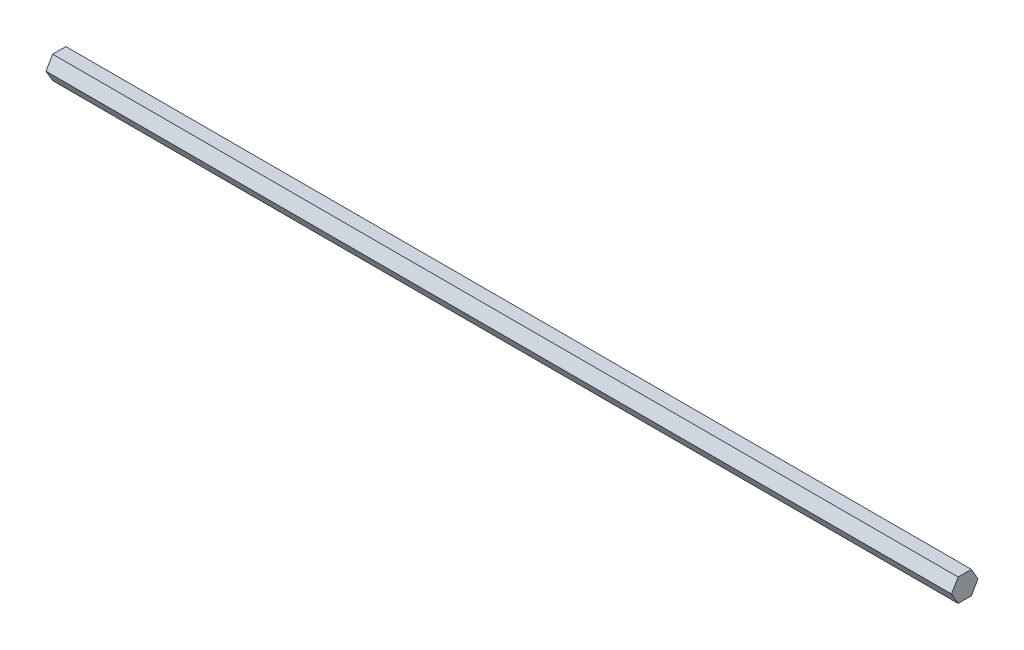
ISO-10303-21;
HEADER;
FILE_DESCRIPTION(('STEP AP214'),'2;1');
FILE_NAME('part.step','',(''),(''),'','','');
FILE_SCHEMA(('AUTOMOTIVE_DESIGN { 1 0 10303 214 1 1 1 1 }'));
ENDSEC;
DATA;
#1=APPLICATION_CONTEXT('core data for automotive mechanical design processes');
#2=APPLICATION_PROTOCOL_DEFINITION('international standard','automotive_design',2000,#1);
#3=PRODUCT_CONTEXT('',#1,'mechanical');
#4=PRODUCT('Part','Part','',(#3));
#5=PRODUCT_RELATED_PRODUCT_CATEGORY('part','',(#4));
#6=PRODUCT_DEFINITION_FORMATION('','',#4);
#7=PRODUCT_DEFINITION_CONTEXT('part definition',#1,'design');
#8=PRODUCT_DEFINITION('design','',#6,#7);
#9=PRODUCT_DEFINITION_SHAPE('','',#8);
#10=(LENGTH_UNIT() NAMED_UNIT(*) SI_UNIT(.MILLI.,.METRE.));
#11=(NAMED_UNIT(*) PLANE_ANGLE_UNIT() SI_UNIT($,.RADIAN.));
#12=(NAMED_UNIT(*) SI_UNIT($,.STERADIAN.) SOLID_ANGLE_UNIT());
#13=UNCERTAINTY_MEASURE_WITH_UNIT(LENGTH_MEASURE(1.E-05),#10,'distance_accuracy_value','');
#14=(GEOMETRIC_REPRESENTATION_CONTEXT(3) GLOBAL_UNCERTAINTY_ASSIGNED_CONTEXT((#13)) GLOBAL_UNIT_ASSIGNED_CONTEXT((#10,
#11,#12)) REPRESENTATION_CONTEXT('',''));
#15=CARTESIAN_POINT('',(0.,0.,0.));
#16=DIRECTION('',(0.,0.,1.));
#17=DIRECTION('',(1.,0.,0.));
#18=AXIS2_PLACEMENT_3D('',#15,#16,#17);
#19=CARTESIAN_POINT('',(250.825,6.35,-3.66617420935412));
#20=DIRECTION('',(0.,-1.,0.));
#21=DIRECTION('',(0.,0.,-1.));
#22=AXIS2_PLACEMENT_3D('',#19,#20,#21);
#23=PLANE('',#22);
#24=DIRECTION('',(0.,0.,1.));
#25=VECTOR('',#24,1.);
#26=CARTESIAN_POINT('',(-250.825,6.35,-3.66617420935412));
#27=LINE('',#26,#25);
#28=CARTESIAN_POINT('',(-250.825,6.35,-3.66617420935412));
#29=VERTEX_POINT('',#28);
#30=CARTESIAN_POINT('',(-250.825,6.35,3.66617420935412));
#31=VERTEX_POINT('',#30);
#32=EDGE_CURVE('E119',#29,#31,#27,.T.);
#33=ORIENTED_EDGE('',*,*,#32,.T.);
#34=DIRECTION('',(-1.,0.,0.));
#35=VECTOR('',#34,1.);
#36=CARTESIAN_POINT('',(250.825,6.35,3.66617420935412));
#37=LINE('',#36,#35);
#38=CARTESIAN_POINT('',(250.825,6.35,3.66617420935412));
#39=VERTEX_POINT('',#38);
#40=EDGE_CURVE('E11',#39,#31,#37,.T.);
#41=ORIENTED_EDGE('',*,*,#40,.F.);
#42=DIRECTION('',(0.,0.,1.));
#43=VECTOR('',#42,1.);
#44=CARTESIAN_POINT('',(250.825,6.35,-3.66617420935412));
#45=LINE('',#44,#43);
#46=CARTESIAN_POINT('',(250.825,6.35,-3.66617420935412));
#47=VERTEX_POINT('',#46);
#48=EDGE_CURVE('E129',#47,#39,#45,.T.);
#49=ORIENTED_EDGE('',*,*,#48,.F.);
#50=DIRECTION('',(-1.,0.,0.));
#51=VECTOR('',#50,1.);
#52=CARTESIAN_POINT('',(250.825,6.35,-3.66617420935412));
#53=LINE('',#52,#51);
#54=EDGE_CURVE('E115',#47,#29,#53,.T.);
#55=ORIENTED_EDGE('',*,*,#54,.T.);
#56=EDGE_LOOP('',(#33,#41,#49,#55));
#57=FACE_BOUND('',#56,.T.);
#58=ADVANCED_FACE('F35',(#57),#23,.F.);
#59=CARTESIAN_POINT('',(250.825,6.35,3.66617420935412));
#60=DIRECTION('',(0.,-0.5,-0.866025403784438));
#61=DIRECTION('',(0.,0.866025403784439,-0.5));
#62=AXIS2_PLACEMENT_3D('',#59,#60,#61);
#63=PLANE('',#62);
#64=DIRECTION('',(0.,-0.866025403784438,0.5));
#65=VECTOR('',#64,1.);
#66=CARTESIAN_POINT('',(-250.825,6.35,3.66617420935412));
#67=LINE('',#66,#65);
#68=CARTESIAN_POINT('',(-250.825,0.,7.33234841870825));
#69=VERTEX_POINT('',#68);
#70=EDGE_CURVE('E122',#31,#69,#67,.T.);
#71=ORIENTED_EDGE('',*,*,#70,.T.);
#72=DIRECTION('',(-1.,0.,0.));
#73=VECTOR('',#72,1.);
#74=CARTESIAN_POINT('',(250.825,0.,7.33234841870825));
#75=LINE('',#74,#73);
#76=CARTESIAN_POINT('',(250.825,0.,7.33234841870825));
#77=VERTEX_POINT('',#76);
#78=EDGE_CURVE('E43',#77,#69,#75,.T.);
#79=ORIENTED_EDGE('',*,*,#78,.F.);
#80=DIRECTION('',(0.,-0.866025403784438,0.5));
#81=VECTOR('',#80,1.);
#82=CARTESIAN_POINT('',(250.825,6.35,3.66617420935412));
#83=LINE('',#82,#81);
#84=EDGE_CURVE('E88',#39,#77,#83,.T.);
#85=ORIENTED_EDGE('',*,*,#84,.F.);
#86=ORIENTED_EDGE('',*,*,#40,.T.);
#87=EDGE_LOOP('',(#71,#79,#85,#86));
#88=FACE_BOUND('',#87,.T.);
#89=ADVANCED_FACE('F153',(#88),#63,.F.);
#90=CARTESIAN_POINT('',(250.825,0.,7.33234841870825));
#91=DIRECTION('',(0.,0.5,-0.866025403784439));
#92=DIRECTION('',(0.,0.866025403784439,0.5));
#93=AXIS2_PLACEMENT_3D('',#90,#91,#92);
#94=PLANE('',#93);
#95=DIRECTION('',(0.,-0.866025403784439,-0.5));
#96=VECTOR('',#95,1.);
#97=CARTESIAN_POINT('',(-250.825,0.,7.33234841870825));
#98=LINE('',#97,#96);
#99=CARTESIAN_POINT('',(-250.825,-6.35,3.66617420935413));
#100=VERTEX_POINT('',#99);
#101=EDGE_CURVE('E124',#69,#100,#98,.T.);
#102=ORIENTED_EDGE('',*,*,#101,.T.);
#103=DIRECTION('',(-1.,0.,0.));
#104=VECTOR('',#103,1.);
#105=CARTESIAN_POINT('',(250.825,-6.35,3.66617420935413));
#106=LINE('',#105,#104);
#107=CARTESIAN_POINT('',(250.825,-6.35,3.66617420935413));
#108=VERTEX_POINT('',#107);
#109=EDGE_CURVE('E110',#108,#100,#106,.T.);
#110=ORIENTED_EDGE('',*,*,#109,.F.);
#111=DIRECTION('',(0.,-0.866025403784439,-0.5));
#112=VECTOR('',#111,1.);
#113=CARTESIAN_POINT('',(250.825,0.,7.33234841870825));
#114=LINE('',#113,#112);
#115=EDGE_CURVE('E101',#77,#108,#114,.T.);
#116=ORIENTED_EDGE('',*,*,#115,.F.);
#117=ORIENTED_EDGE('',*,*,#78,.T.);
#118=EDGE_LOOP('',(#102,#110,#116,#117));
#119=FACE_BOUND('',#118,.T.);
#120=ADVANCED_FACE('F135',(#119),#94,.F.);
#121=CARTESIAN_POINT('',(250.825,-6.35,3.66617420935413));
#122=DIRECTION('',(0.,1.,0.));
#123=DIRECTION('',(0.,0.,1.));
#124=AXIS2_PLACEMENT_3D('',#121,#122,#123);
#125=PLANE('',#124);
#126=DIRECTION('',(0.,0.,-1.));
#127=VECTOR('',#126,1.);
#128=CARTESIAN_POINT('',(-250.825,-6.35,3.66617420935413));
#129=LINE('',#128,#127);
#130=CARTESIAN_POINT('',(-250.825,-6.35,-3.66617420935412));
#131=VERTEX_POINT('',#130);
#132=EDGE_CURVE('E109',#100,#131,#129,.T.);
#133=ORIENTED_EDGE('',*,*,#132,.T.);
#134=DIRECTION('',(-1.,0.,0.));
#135=VECTOR('',#134,1.);
#136=CARTESIAN_POINT('',(250.825,-6.35,-3.66617420935412));
#137=LINE('',#136,#135);
#138=CARTESIAN_POINT('',(250.825,-6.35,-3.66617420935412));
#139=VERTEX_POINT('',#138);
#140=EDGE_CURVE('E106',#139,#131,#137,.T.);
#141=ORIENTED_EDGE('',*,*,#140,.F.);
#142=DIRECTION('',(0.,0.,-1.));
#143=VECTOR('',#142,1.);
#144=CARTESIAN_POINT('',(250.825,-6.35,3.66617420935413));
#145=LINE('',#144,#143);
#146=EDGE_CURVE('E95',#108,#139,#145,.T.);
#147=ORIENTED_EDGE('',*,*,#146,.F.);
#148=ORIENTED_EDGE('',*,*,#109,.T.);
#149=EDGE_LOOP('',(#133,#141,#147,#148));
#150=FACE_BOUND('',#149,.T.);
#151=ADVANCED_FACE('F107',(#150),#125,.F.);
#152=CARTESIAN_POINT('',(250.825,-6.35,-3.66617420935412));
#153=DIRECTION('',(0.,0.5,0.866025403784439));
#154=DIRECTION('',(0.,-0.866025403784439,0.5));
#155=AXIS2_PLACEMENT_3D('',#152,#153,#154);
#156=PLANE('',#155);
#157=DIRECTION('',(0.,0.866025403784439,-0.5));
#158=VECTOR('',#157,1.);
#159=CARTESIAN_POINT('',(-250.825,-6.35,-3.66617420935412));
#160=LINE('',#159,#158);
#161=CARTESIAN_POINT('',(-250.825,0.,-7.33234841870825));
#162=VERTEX_POINT('',#161);
#163=EDGE_CURVE('E74',#131,#162,#160,.T.);
#164=ORIENTED_EDGE('',*,*,#163,.T.);
#165=DIRECTION('',(-1.,0.,0.));
#166=VECTOR('',#165,1.);
#167=CARTESIAN_POINT('',(250.825,0.,-7.33234841870825));
#168=LINE('',#167,#166);
#169=CARTESIAN_POINT('',(250.825,0.,-7.33234841870825));
#170=VERTEX_POINT('',#169);
#171=EDGE_CURVE('E111',#170,#162,#168,.T.);
#172=ORIENTED_EDGE('',*,*,#171,.F.);
#173=DIRECTION('',(0.,0.866025403784439,-0.5));
#174=VECTOR('',#173,1.);
#175=CARTESIAN_POINT('',(250.825,-6.35,-3.66617420935412));
#176=LINE('',#175,#174);
#177=EDGE_CURVE('E99',#139,#170,#176,.T.);
#178=ORIENTED_EDGE('',*,*,#177,.F.);
#179=ORIENTED_EDGE('',*,*,#140,.T.);
#180=EDGE_LOOP('',(#164,#172,#178,#179));
#181=FACE_BOUND('',#180,.T.);
#182=ADVANCED_FACE('F113',(#181),#156,.F.);
#183=CARTESIAN_POINT('',(250.825,0.,-7.33234841870825));
#184=DIRECTION('',(0.,-0.5,0.866025403784439));
#185=DIRECTION('',(0.,-0.866025403784439,-0.5));
#186=AXIS2_PLACEMENT_3D('',#183,#184,#185);
#187=PLANE('',#186);
#188=DIRECTION('',(0.,0.866025403784439,0.5));
#189=VECTOR('',#188,1.);
#190=CARTESIAN_POINT('',(-250.825,0.,-7.33234841870825));
#191=LINE('',#190,#189);
#192=EDGE_CURVE('E80',#162,#29,#191,.T.);
#193=ORIENTED_EDGE('',*,*,#192,.T.);
#194=ORIENTED_EDGE('',*,*,#54,.F.);
#195=DIRECTION('',(0.,0.866025403784439,0.5));
#196=VECTOR('',#195,1.);
#197=CARTESIAN_POINT('',(250.825,0.,-7.33234841870825));
#198=LINE('',#197,#196);
#199=EDGE_CURVE('E51',#170,#47,#198,.T.);
#200=ORIENTED_EDGE('',*,*,#199,.F.);
#201=ORIENTED_EDGE('',*,*,#171,.T.);
#202=EDGE_LOOP('',(#193,#194,#200,#201));
#203=FACE_BOUND('',#202,.T.);
#204=ADVANCED_FACE('F142',(#203),#187,.F.);
#205=CARTESIAN_POINT('',(250.825,0.,0.));
#206=DIRECTION('',(1.,0.,0.));
#207=DIRECTION('',(0.,0.,-1.));
#208=AXIS2_PLACEMENT_3D('',#205,#206,#207);
#209=PLANE('',#208);
#210=ORIENTED_EDGE('',*,*,#48,.T.);
#211=ORIENTED_EDGE('',*,*,#84,.T.);
#212=ORIENTED_EDGE('',*,*,#115,.T.);
#213=ORIENTED_EDGE('',*,*,#146,.T.);
#214=ORIENTED_EDGE('',*,*,#177,.T.);
#215=ORIENTED_EDGE('',*,*,#199,.T.);
#216=EDGE_LOOP('',(#210,#211,#212,#213,#214,#215));
#217=FACE_BOUND('',#216,.T.);
#218=ADVANCED_FACE('F97',(#217),#209,.T.);
#219=CARTESIAN_POINT('',(-250.825,0.,0.));
#220=DIRECTION('',(1.,0.,0.));
#221=DIRECTION('',(0.,0.,-1.));
#222=AXIS2_PLACEMENT_3D('',#219,#220,#221);
#223=PLANE('',#222);
#224=ORIENTED_EDGE('',*,*,#32,.F.);
#225=ORIENTED_EDGE('',*,*,#192,.F.);
#226=ORIENTED_EDGE('',*,*,#163,.F.);
#227=ORIENTED_EDGE('',*,*,#132,.F.);
#228=ORIENTED_EDGE('',*,*,#101,.F.);
#229=ORIENTED_EDGE('',*,*,#70,.F.);
#230=EDGE_LOOP('',(#224,#225,#226,#227,#228,#229));
#231=FACE_BOUND('',#230,.T.);
#232=ADVANCED_FACE('F138',(#231),#223,.F.);
#233=CLOSED_SHELL('',(#58,#89,#120,#151,#182,#204,#218,#232));
#234=MANIFOLD_SOLID_BREP('B2',#233);
#235=ADVANCED_BREP_SHAPE_REPRESENTATION('',(#18,#234),#14);
#236=SHAPE_DEFINITION_REPRESENTATION(#9,#235);
ENDSEC;
END-ISO-10303-21;
